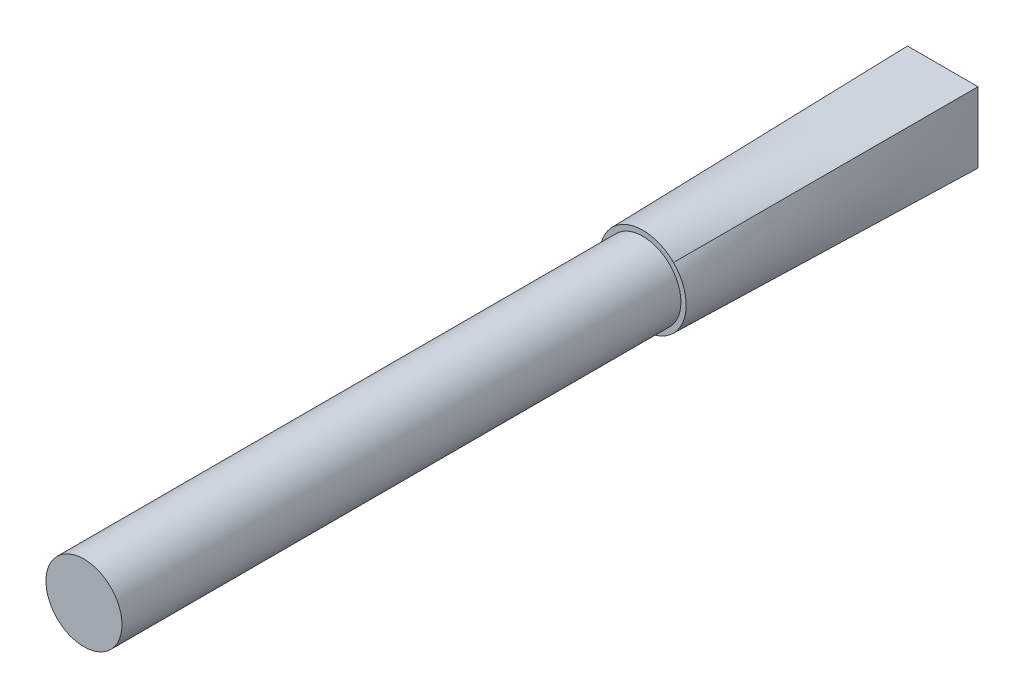
ISO-10303-21;
HEADER;
FILE_DESCRIPTION(('STEP AP214'),'2;1');
FILE_NAME('part.step','',(''),(''),'','','');
FILE_SCHEMA(('AUTOMOTIVE_DESIGN { 1 0 10303 214 1 1 1 1 }'));
ENDSEC;
DATA;
#1=APPLICATION_CONTEXT('core data for automotive mechanical design processes');
#2=APPLICATION_PROTOCOL_DEFINITION('international standard','automotive_design',2000,#1);
#3=PRODUCT_CONTEXT('',#1,'mechanical');
#4=PRODUCT('Part','Part','',(#3));
#5=PRODUCT_RELATED_PRODUCT_CATEGORY('part','',(#4));
#6=PRODUCT_DEFINITION_FORMATION('','',#4);
#7=PRODUCT_DEFINITION_CONTEXT('part definition',#1,'design');
#8=PRODUCT_DEFINITION('design','',#6,#7);
#9=PRODUCT_DEFINITION_SHAPE('','',#8);
#10=(LENGTH_UNIT() NAMED_UNIT(*) SI_UNIT(.MILLI.,.METRE.));
#11=(NAMED_UNIT(*) PLANE_ANGLE_UNIT() SI_UNIT($,.RADIAN.));
#12=(NAMED_UNIT(*) SI_UNIT($,.STERADIAN.) SOLID_ANGLE_UNIT());
#13=UNCERTAINTY_MEASURE_WITH_UNIT(LENGTH_MEASURE(1.E-05),#10,'distance_accuracy_value','');
#14=(GEOMETRIC_REPRESENTATION_CONTEXT(3) GLOBAL_UNCERTAINTY_ASSIGNED_CONTEXT((#13)) GLOBAL_UNIT_ASSIGNED_CONTEXT((#10,
#11,#12)) REPRESENTATION_CONTEXT('',''));
#15=CARTESIAN_POINT('',(0.,0.,0.));
#16=DIRECTION('',(0.,0.,1.));
#17=DIRECTION('',(1.,0.,0.));
#18=AXIS2_PLACEMENT_3D('',#15,#16,#17);
#19=CARTESIAN_POINT('',(-46.9561399874186,36.6857906592663,17.));
#20=DIRECTION('',(0.,0.,-1.));
#21=DIRECTION('',(-1.,0.,0.));
#22=AXIS2_PLACEMENT_3D('',#19,#20,#21);
#23=CYLINDRICAL_SURFACE('',#22,6.15);
#24=CARTESIAN_POINT('',(-46.9561399874186,36.6857906592663,17.));
#25=DIRECTION('',(0.,0.,1.));
#26=DIRECTION('',(1.,0.,0.));
#27=AXIS2_PLACEMENT_3D('',#24,#25,#26);
#28=CIRCLE('',#27,6.15);
#29=CARTESIAN_POINT('',(-40.8061399874186,36.6857906592663,17.));
#30=VERTEX_POINT('',#29);
#31=EDGE_CURVE('E269',#30,#30,#28,.T.);
#32=ORIENTED_EDGE('',*,*,#31,.F.);
#33=EDGE_LOOP('',(#32));
#34=FACE_BOUND('',#33,.T.);
#35=CARTESIAN_POINT('',(-46.9561399874186,36.6857906592663,-73.4));
#36=DIRECTION('',(0.,0.,1.));
#37=DIRECTION('',(1.,0.,0.));
#38=AXIS2_PLACEMENT_3D('',#35,#36,#37);
#39=CIRCLE('',#38,6.15);
#40=CARTESIAN_POINT('',(-40.8061399874186,36.6857906592663,-73.4));
#41=VERTEX_POINT('',#40);
#42=EDGE_CURVE('E408',#41,#41,#39,.T.);
#43=ORIENTED_EDGE('',*,*,#42,.T.);
#44=EDGE_LOOP('',(#43));
#45=FACE_BOUND('',#44,.T.);
#46=ADVANCED_FACE('F69',(#34,#45),#23,.T.);
#47=CARTESIAN_POINT('',(-46.9561399874186,36.6857906592663,17.));
#48=DIRECTION('',(0.,0.,1.));
#49=DIRECTION('',(1.,0.,0.));
#50=AXIS2_PLACEMENT_3D('',#47,#48,#49);
#51=PLANE('',#50);
#52=ORIENTED_EDGE('',*,*,#31,.T.);
#53=EDGE_LOOP('',(#52));
#54=FACE_BOUND('',#53,.T.);
#55=ADVANCED_FACE('F254',(#54),#51,.T.);
#56=CARTESIAN_POINT('',(-46.9561399874187,36.6857906592662,-73.4));
#57=DIRECTION('',(0.,0.,-1.));
#58=DIRECTION('',(-1.,0.,0.));
#59=AXIS2_PLACEMENT_3D('',#56,#57,#58);
#60=PLANE('',#59);
#61=ORIENTED_EDGE('',*,*,#42,.F.);
#62=EDGE_LOOP('',(#61));
#63=FACE_BOUND('',#62,.T.);
#64=CARTESIAN_POINT('',(-42.0063925191129,31.7360431909604,-73.4));
#65=CARTESIAN_POINT('',(-42.1456633403766,31.5968151956162,-73.4));
#66=CARTESIAN_POINT('',(-42.2908078767657,31.4634508637086,-73.4));
#67=CARTESIAN_POINT('',(-42.5917886116688,31.2094045075986,-73.4));
#68=CARTESIAN_POINT('',(-42.7476243084859,31.0887218889621,-73.4));
#69=CARTESIAN_POINT('',(-43.0687841504961,30.8610946060958,-73.4));
#70=CARTESIAN_POINT('',(-43.2340986487157,30.7541363208907,-73.4));
#71=CARTESIAN_POINT('',(-43.5732181859183,30.5544239115388,-73.4));
#72=CARTESIAN_POINT('',(-43.7470268764009,30.4616759682783,-73.4));
#73=CARTESIAN_POINT('',(-44.013132376626,30.3337643078239,-73.4));
#74=CARTESIAN_POINT('',(-44.1027672788285,30.2929823898799,-73.4));
#75=CARTESIAN_POINT('',(-44.283690679333,30.2152682059981,-73.4));
#76=CARTESIAN_POINT('',(-44.3749791765763,30.1783359375957,-73.4));
#77=CARTESIAN_POINT('',(-44.6509670196658,30.0733900300036,-73.4));
#78=CARTESIAN_POINT('',(-44.8379062949972,30.01117086082,-73.4));
#79=CARTESIAN_POINT('',(-45.2163391316847,29.9026393904692,-73.4));
#80=CARTESIAN_POINT('',(-45.4078329552131,29.8563280073785,-73.4));
#81=CARTESIAN_POINT('',(-45.7940584104982,29.780132469075,-73.4));
#82=CARTESIAN_POINT('',(-45.9887900237924,29.7502482202235,-73.4));
#83=CARTESIAN_POINT('',(-46.3799221774178,29.7068820965488,-73.4));
#84=CARTESIAN_POINT('',(-46.5763211352012,29.6933861112952,-73.4));
#85=CARTESIAN_POINT('',(-46.871203708463,29.6856193020037,-73.4));
#86=CARTESIAN_POINT('',(-46.9695562365239,29.6851105327817,-73.4));
#87=CARTESIAN_POINT('',(-47.1661945841645,29.6882702486812,-73.4));
#88=CARTESIAN_POINT('',(-47.2644804029289,29.6919387839746,-73.4));
#89=CARTESIAN_POINT('',(-47.5590032335952,29.7091278738986,-73.4));
#90=CARTESIAN_POINT('',(-47.754915119356,29.7288316702664,-73.4));
#91=CARTESIAN_POINT('',(-48.1443633002955,29.7846189507533,-73.4));
#92=CARTESIAN_POINT('',(-48.3378996329995,29.820702175793,-73.4));
#93=CARTESIAN_POINT('',(-48.7213220459782,29.9091724755786,-73.4));
#94=CARTESIAN_POINT('',(-48.9112065342883,29.9615664970428,-73.4));
#95=CARTESIAN_POINT('',(-49.2858702535804,30.0820070840367,-73.4));
#96=CARTESIAN_POINT('',(-49.4706491662281,30.1500546231125,-73.4));
#97=CARTESIAN_POINT('',(-50.0151995599403,30.3773157024135,-73.4));
#98=CARTESIAN_POINT('',(-50.3657623598617,30.5597808738954,-73.3999999999999));
#99=CARTESIAN_POINT('',(-50.8072974833803,30.8389839696204,-73.4));
#100=CARTESIAN_POINT('',(-50.9146103030249,30.9110863168082,-73.4));
#101=CARTESIAN_POINT('',(-51.1250667563629,31.0611439523448,-73.4));
#102=CARTESIAN_POINT('',(-51.2282112645006,31.1390980031922,-73.4));
#103=CARTESIAN_POINT('',(-51.5306352543509,31.3810916534136,-73.4));
#104=CARTESIAN_POINT('',(-51.7232809541746,31.5535007788598,-73.3999999999999));
#105=CARTESIAN_POINT('',(-51.9058874557245,31.7360431909604,-73.4));
#106=B_SPLINE_CURVE_WITH_KNOTS('',3,(#64,#65,#66,#67,#68,#69,#70,#71,#72,#73,#74,#75,#76,#77,
#78,#79,#80,#81,#82,#83,#84,#85,#86,#87,#88,#89,#90,#91,#92,#93,#94,#95,#96,#97,#98,#99,#100,
#101,#102,#103,#104,#105),.UNSPECIFIED.,.F.,.F.,(4,2,2,2,2,2,2,2,2,2,2,2,2,2,2,2,2,2,2,2,4),(0.,
0.590627625091379,1.18122755313352,1.77123671918134,2.36150178967361,2.65685399542576,
2.95220601208947,3.54252005496077,4.13286816054907,4.72321290097602,5.31304898847596,
5.60803281329684,5.90302018108694,6.49296649966613,7.08290348717232,7.67309207156466,
8.26331737174196,9.44201062753643,9.82976176125312,10.2174311242531,10.9914431983338),.UNSPECIFIED.);
#107=CARTESIAN_POINT('',(-42.0063925191129,31.7360431909604,-73.4));
#108=VERTEX_POINT('',#107);
#109=CARTESIAN_POINT('',(-51.9058874557245,31.7360431909604,-73.4));
#110=VERTEX_POINT('',#109);
#111=EDGE_CURVE('E239',#108,#110,#106,.T.);
#112=ORIENTED_EDGE('',*,*,#111,.F.);
#113=CARTESIAN_POINT('',(-42.0063925191129,41.6355381275721,-73.4));
#114=CARTESIAN_POINT('',(-41.8671645237687,41.4962673063083,-73.4));
#115=CARTESIAN_POINT('',(-41.7338001918611,41.3511227699192,-73.4));
#116=CARTESIAN_POINT('',(-41.4797538357511,41.0501420350162,-73.4));
#117=CARTESIAN_POINT('',(-41.3590712171146,40.8943063381991,-73.4));
#118=CARTESIAN_POINT('',(-41.1314439342483,40.5731464961889,-73.4));
#119=CARTESIAN_POINT('',(-41.0244856490432,40.4078319979693,-73.4));
#120=CARTESIAN_POINT('',(-40.8247732396912,40.0687124607667,-73.4));
#121=CARTESIAN_POINT('',(-40.7320252964308,39.8949037702841,-73.3999999999999));
#122=CARTESIAN_POINT('',(-40.6041136359764,39.6287982700591,-73.4));
#123=CARTESIAN_POINT('',(-40.5633317180323,39.5391633678566,-73.4));
#124=CARTESIAN_POINT('',(-40.4856175341506,39.358239967352,-73.4));
#125=CARTESIAN_POINT('',(-40.4486852657482,39.2669514701087,-73.4));
#126=CARTESIAN_POINT('',(-40.3437393581561,38.9909636270193,-73.4));
#127=CARTESIAN_POINT('',(-40.2815201889725,38.8040243516879,-73.4));
#128=CARTESIAN_POINT('',(-40.1729887186216,38.4255915150004,-73.4));
#129=CARTESIAN_POINT('',(-40.126677335531,38.2340976914721,-73.4));
#130=CARTESIAN_POINT('',(-40.0504817972274,37.8478722361869,-73.4));
#131=CARTESIAN_POINT('',(-40.020597548376,37.6531406228927,-73.4));
#132=CARTESIAN_POINT('',(-39.9772314247013,37.2620084692674,-73.4));
#133=CARTESIAN_POINT('',(-39.9637354394477,37.065609511484,-73.4));
#134=CARTESIAN_POINT('',(-39.9559686301562,36.7707269382222,-73.4));
#135=CARTESIAN_POINT('',(-39.9554598609341,36.6723744101613,-73.4));
#136=CARTESIAN_POINT('',(-39.9586195768336,36.4757360625207,-73.4));
#137=CARTESIAN_POINT('',(-39.9622881121271,36.3774502437563,-73.4));
#138=CARTESIAN_POINT('',(-39.9794772020511,36.08292741309,-73.4));
#139=CARTESIAN_POINT('',(-39.9991809984188,35.8870155273292,-73.4));
#140=CARTESIAN_POINT('',(-40.0549682789058,35.4975673463897,-73.4));
#141=CARTESIAN_POINT('',(-40.0910515039454,35.3040310136857,-73.4));
#142=CARTESIAN_POINT('',(-40.179521803731,34.920608600707,-73.4));
#143=CARTESIAN_POINT('',(-40.2319158251951,34.7307241123969,-73.4));
#144=CARTESIAN_POINT('',(-40.352356412189,34.3560603931048,-73.4));
#145=CARTESIAN_POINT('',(-40.4204039512648,34.1712814804571,-73.4));
#146=CARTESIAN_POINT('',(-40.6476650305658,33.6267310867449,-73.4));
#147=CARTESIAN_POINT('',(-40.8301302020477,33.2761682868235,-73.4));
#148=CARTESIAN_POINT('',(-41.1093332977727,32.8346331633049,-73.4));
#149=CARTESIAN_POINT('',(-41.1814356449605,32.7273203436602,-73.4));
#150=CARTESIAN_POINT('',(-41.3314932804971,32.5168638903221,-73.4));
#151=CARTESIAN_POINT('',(-41.4094473313445,32.4137193821844,-73.4));
#152=CARTESIAN_POINT('',(-41.6514409815659,32.1112953923341,-73.4));
#153=CARTESIAN_POINT('',(-41.8238501070122,31.9186496925104,-73.4));
#154=CARTESIAN_POINT('',(-42.0063925191129,31.7360431909604,-73.4));
#155=B_SPLINE_CURVE_WITH_KNOTS('',3,(#113,#114,#115,#116,#117,#118,#119,#120,#121,#122,#123,
#124,#125,#126,#127,#128,#129,#130,#131,#132,#133,#134,#135,#136,#137,#138,#139,#140,#141,#142,
#143,#144,#145,#146,#147,#148,#149,#150,#151,#152,#153,#154),.UNSPECIFIED.,.F.,.F.,(4,2,2,2,2,2,
2,2,2,2,2,2,2,2,2,2,2,2,2,2,4),(0.,0.590627625091344,1.18122755313346,1.77123671918127,
2.36150178967351,2.65685399542565,2.95220601208934,3.54252005496062,4.1328681605489,
4.72321290097582,5.31304898847573,5.60803281329661,5.90302018108667,6.49296649966585,
7.08290348717201,7.67309207156436,8.26331737174168,9.44201062753618,9.82976176125293,
10.2174311242529,10.9914431983338),.UNSPECIFIED.);
#156=CARTESIAN_POINT('',(-42.0063925191129,41.6355381275721,-73.4));
#157=VERTEX_POINT('',#156);
#158=EDGE_CURVE('E190',#157,#108,#155,.T.);
#159=ORIENTED_EDGE('',*,*,#158,.F.);
#160=CARTESIAN_POINT('',(-51.9058874557245,41.6355381275721,-73.4));
#161=CARTESIAN_POINT('',(-51.7666166344608,41.7747661229162,-73.4));
#162=CARTESIAN_POINT('',(-51.6214720980717,41.9081304548239,-73.4));
#163=CARTESIAN_POINT('',(-51.3204913631686,42.1621768109338,-73.4));
#164=CARTESIAN_POINT('',(-51.1646556663515,42.2828594295704,-73.4));
#165=CARTESIAN_POINT('',(-50.8434958243414,42.5104867124366,-73.4));
#166=CARTESIAN_POINT('',(-50.6781813261218,42.6174449976417,-73.4));
#167=CARTESIAN_POINT('',(-50.3390617889192,42.8171574069937,-73.4));
#168=CARTESIAN_POINT('',(-50.1652530984366,42.9099053502542,-73.4));
#169=CARTESIAN_POINT('',(-49.8991475982116,43.0378170107085,-73.4));
#170=CARTESIAN_POINT('',(-49.8095126960091,43.0785989286526,-73.4));
#171=CARTESIAN_POINT('',(-49.6285892955045,43.1563131125343,-73.4));
#172=CARTESIAN_POINT('',(-49.5373007982612,43.1932453809367,-73.4));
#173=CARTESIAN_POINT('',(-49.2613129551718,43.2981912885288,-73.4));
#174=CARTESIAN_POINT('',(-49.0743736798404,43.3604104577125,-73.4));
#175=CARTESIAN_POINT('',(-48.6959408431529,43.4689419280633,-73.4));
#176=CARTESIAN_POINT('',(-48.5044470196246,43.515253311154,-73.4));
#177=CARTESIAN_POINT('',(-48.1182215643394,43.5914488494575,-73.4));
#178=CARTESIAN_POINT('',(-47.9234899510453,43.6213330983089,-73.4));
#179=CARTESIAN_POINT('',(-47.5323577974199,43.6646992219836,-73.4));
#180=CARTESIAN_POINT('',(-47.3359588396365,43.6781952072373,-73.4));
#181=CARTESIAN_POINT('',(-47.0410762663748,43.6859620165288,-73.4));
#182=CARTESIAN_POINT('',(-46.9427237383138,43.6864707857508,-73.4));
#183=CARTESIAN_POINT('',(-46.7460853906732,43.6833110698513,-73.4));
#184=CARTESIAN_POINT('',(-46.6477995719089,43.6796425345579,-73.4));
#185=CARTESIAN_POINT('',(-46.3532767412426,43.6624534446339,-73.4));
#186=CARTESIAN_POINT('',(-46.1573648554817,43.6427496482661,-73.4));
#187=CARTESIAN_POINT('',(-45.7679166745422,43.5869623677792,-73.4));
#188=CARTESIAN_POINT('',(-45.5743803418382,43.5508791427395,-73.4));
#189=CARTESIAN_POINT('',(-45.1909579288595,43.4624088429539,-73.4));
#190=CARTESIAN_POINT('',(-45.0010734405494,43.4100148214898,-73.4));
#191=CARTESIAN_POINT('',(-44.6264097212573,43.2895742344959,-73.4));
#192=CARTESIAN_POINT('',(-44.4416308086096,43.2215266954201,-73.4));
#193=CARTESIAN_POINT('',(-43.8970804148975,42.9942656161192,-73.4));
#194=CARTESIAN_POINT('',(-43.5465176149761,42.8118004446373,-73.4));
#195=CARTESIAN_POINT('',(-43.1049824914575,42.5325973489124,-73.4));
#196=CARTESIAN_POINT('',(-42.9976696718128,42.4604950017245,-73.4));
#197=CARTESIAN_POINT('',(-42.7872132184747,42.3104373661879,-73.4));
#198=CARTESIAN_POINT('',(-42.684068710337,42.2324833153405,-73.4));
#199=CARTESIAN_POINT('',(-42.3816447204866,41.990489665119,-73.4));
#200=CARTESIAN_POINT('',(-42.1889990206629,41.8180805396727,-73.4));
#201=CARTESIAN_POINT('',(-42.0063925191129,41.6355381275721,-73.4));
#202=B_SPLINE_CURVE_WITH_KNOTS('',3,(#160,#161,#162,#163,#164,#165,#166,#167,#168,#169,#170,
#171,#172,#173,#174,#175,#176,#177,#178,#179,#180,#181,#182,#183,#184,#185,#186,#187,#188,#189,
#190,#191,#192,#193,#194,#195,#196,#197,#198,#199,#200,#201),.UNSPECIFIED.,.F.,.F.,(4,2,2,2,2,2,
2,2,2,2,2,2,2,2,2,2,2,2,2,2,4),(0.,0.590627625091339,1.18122755313344,1.77123671918122,
2.36150178967346,2.65685399542559,2.95220601208926,3.54252005496053,4.13286816054879,
4.7232129009757,5.31304898847563,5.60803281329651,5.90302018108659,6.49296649966579,
7.08290348717196,7.67309207156428,8.26331737174156,9.44201062753598,9.82976176125276,
10.2174311242528,10.9914431983338),.UNSPECIFIED.);
#203=CARTESIAN_POINT('',(-51.9058874557245,41.6355381275721,-73.4));
#204=VERTEX_POINT('',#203);
#205=EDGE_CURVE('E192',#204,#157,#202,.T.);
#206=ORIENTED_EDGE('',*,*,#205,.F.);
#207=CARTESIAN_POINT('',(-51.9058874557245,31.7360431909604,-73.4));
#208=CARTESIAN_POINT('',(-52.0451154510687,31.8753140122242,-73.4));
#209=CARTESIAN_POINT('',(-52.1784797829763,32.0204585486132,-73.4));
#210=CARTESIAN_POINT('',(-52.4325261390863,32.3214392835163,-73.4));
#211=CARTESIAN_POINT('',(-52.5532087577228,32.4772749803334,-73.4));
#212=CARTESIAN_POINT('',(-52.7808360405891,32.7984348223435,-73.4));
#213=CARTESIAN_POINT('',(-52.8877943257942,32.9637493205632,-73.4));
#214=CARTESIAN_POINT('',(-53.0875067351461,33.3028688577657,-73.4));
#215=CARTESIAN_POINT('',(-53.1802546784066,33.4766775482483,-73.4));
#216=CARTESIAN_POINT('',(-53.308166338861,33.7427830484733,-73.4));
#217=CARTESIAN_POINT('',(-53.348948256805,33.8324179506759,-73.4));
#218=CARTESIAN_POINT('',(-53.4266624406868,34.0133413511804,-73.4));
#219=CARTESIAN_POINT('',(-53.4635947090891,34.1046298484237,-73.4));
#220=CARTESIAN_POINT('',(-53.5685406166813,34.3806176915131,-73.4));
#221=CARTESIAN_POINT('',(-53.6307597858649,34.5675569668445,-73.4));
#222=CARTESIAN_POINT('',(-53.7392912562157,34.945989803532,-73.4));
#223=CARTESIAN_POINT('',(-53.7856026393064,35.1374836270603,-73.4));
#224=CARTESIAN_POINT('',(-53.8617981776099,35.5237090823454,-73.4));
#225=CARTESIAN_POINT('',(-53.8916824264614,35.7184406956396,-73.4));
#226=CARTESIAN_POINT('',(-53.9350485501361,36.1095728492649,-73.4));
#227=CARTESIAN_POINT('',(-53.9485445353897,36.3059718070484,-73.4));
#228=CARTESIAN_POINT('',(-53.9563113446812,36.6008543803102,-73.4));
#229=CARTESIAN_POINT('',(-53.9568201139033,36.6992069083711,-73.4));
#230=CARTESIAN_POINT('',(-53.9536603980038,36.8958452560118,-73.4));
#231=CARTESIAN_POINT('',(-53.9499918627103,36.9941310747761,-73.4));
#232=CARTESIAN_POINT('',(-53.9328027727863,37.2886539054424,-73.4));
#233=CARTESIAN_POINT('',(-53.9130989764186,37.4845657912033,-73.4));
#234=CARTESIAN_POINT('',(-53.8573116959316,37.8740139721428,-73.4));
#235=CARTESIAN_POINT('',(-53.821228470892,38.0675503048468,-73.4));
#236=CARTESIAN_POINT('',(-53.7327581711064,38.4509727178256,-73.4));
#237=CARTESIAN_POINT('',(-53.6803641496422,38.6408572061357,-73.4));
#238=CARTESIAN_POINT('',(-53.5599235626483,39.0155209254278,-73.4));
#239=CARTESIAN_POINT('',(-53.4918760235725,39.2002998380755,-73.4));
#240=CARTESIAN_POINT('',(-53.2646149442715,39.7448502317877,-73.4));
#241=CARTESIAN_POINT('',(-53.0821497727897,40.0954130317091,-73.4000000000001));
#242=CARTESIAN_POINT('',(-52.8029466770647,40.5369481552277,-73.4));
#243=CARTESIAN_POINT('',(-52.7308443298768,40.6442609748724,-73.4));
#244=CARTESIAN_POINT('',(-52.5807866943402,40.8547174282104,-73.4));
#245=CARTESIAN_POINT('',(-52.5028326434929,40.9578619363481,-73.4));
#246=CARTESIAN_POINT('',(-52.2608389932714,41.2602859261984,-73.4));
#247=CARTESIAN_POINT('',(-52.0884298678252,41.4529316260221,-73.4));
#248=CARTESIAN_POINT('',(-51.9058874557245,41.6355381275721,-73.4));
#249=B_SPLINE_CURVE_WITH_KNOTS('',3,(#207,#208,#209,#210,#211,#212,#213,#214,#215,#216,#217,
#218,#219,#220,#221,#222,#223,#224,#225,#226,#227,#228,#229,#230,#231,#232,#233,#234,#235,#236,
#237,#238,#239,#240,#241,#242,#243,#244,#245,#246,#247,#248),.UNSPECIFIED.,.F.,.F.,(4,2,2,2,2,2,
2,2,2,2,2,2,2,2,2,2,2,2,2,2,4),(0.,0.590627625091339,1.18122755313343,1.77123671918121,
2.36150178967344,2.65685399542557,2.95220601208924,3.5425200549605,4.13286816054874,
4.72321290097564,5.31304898847562,5.60803281329653,5.90302018108663,6.49296649966587,
7.08290348717211,7.67309207156445,8.26331737174176,9.44201062753624,9.82976176125298,
10.217431124253,10.9914431983338),.UNSPECIFIED.);
#250=EDGE_CURVE('E260',#110,#204,#249,.T.);
#251=ORIENTED_EDGE('',*,*,#250,.F.);
#252=EDGE_LOOP('',(#112,#159,#206,#251));
#253=FACE_BOUND('',#252,.T.);
#254=ADVANCED_FACE('F250',(#63,#253),#60,.F.);
#255=CARTESIAN_POINT('',(0.,0.,-121.9));
#256=DIRECTION('',(0.,0.,-1.));
#257=DIRECTION('',(-1.,0.,0.));
#258=AXIS2_PLACEMENT_3D('',#255,#256,#257);
#259=PLANE('',#258);
#260=DIRECTION('',(0.,1.,0.));
#261=VECTOR('',#260,1.);
#262=CARTESIAN_POINT('',(-51.8061399874187,31.8357906592662,-121.9));
#263=LINE('',#262,#261);
#264=CARTESIAN_POINT('',(-51.8061399874187,32.8357906592662,-121.9));
#265=VERTEX_POINT('',#264);
#266=CARTESIAN_POINT('',(-51.8061399874187,40.5357906592662,-121.9));
#267=VERTEX_POINT('',#266);
#268=EDGE_CURVE('E307',#265,#267,#263,.T.);
#269=ORIENTED_EDGE('',*,*,#268,.F.);
#270=CARTESIAN_POINT('',(-50.8061399874187,32.8357906592662,-121.9));
#271=DIRECTION('',(0.,0.,-1.));
#272=DIRECTION('',(-1.,0.,0.));
#273=AXIS2_PLACEMENT_3D('',#270,#271,#272);
#274=CIRCLE('',#273,1.);
#275=CARTESIAN_POINT('',(-50.8061399874187,31.8357906592662,-121.9));
#276=VERTEX_POINT('',#275);
#277=EDGE_CURVE('E296',#265,#276,#274,.F.);
#278=ORIENTED_EDGE('',*,*,#277,.T.);
#279=DIRECTION('',(-1.,0.,0.));
#280=VECTOR('',#279,1.);
#281=CARTESIAN_POINT('',(-42.1061399874187,31.8357906592662,-121.9));
#282=LINE('',#281,#280);
#283=CARTESIAN_POINT('',(-43.1061399874187,31.8357906592662,-121.9));
#284=VERTEX_POINT('',#283);
#285=EDGE_CURVE('E333',#284,#276,#282,.T.);
#286=ORIENTED_EDGE('',*,*,#285,.F.);
#287=CARTESIAN_POINT('',(-43.1061399874187,32.8357906592662,-121.9));
#288=DIRECTION('',(0.,0.,-1.));
#289=DIRECTION('',(-1.,0.,0.));
#290=AXIS2_PLACEMENT_3D('',#287,#288,#289);
#291=CIRCLE('',#290,1.);
#292=CARTESIAN_POINT('',(-42.1061399874187,32.8357906592662,-121.9));
#293=VERTEX_POINT('',#292);
#294=EDGE_CURVE('E12',#284,#293,#291,.F.);
#295=ORIENTED_EDGE('',*,*,#294,.T.);
#296=DIRECTION('',(0.,-1.,0.));
#297=VECTOR('',#296,1.);
#298=CARTESIAN_POINT('',(-42.1061399874187,31.8357906592662,-121.9));
#299=LINE('',#298,#297);
#300=CARTESIAN_POINT('',(-42.1061399874187,40.5357906592662,-121.9));
#301=VERTEX_POINT('',#300);
#302=EDGE_CURVE('E301',#301,#293,#299,.T.);
#303=ORIENTED_EDGE('',*,*,#302,.F.);
#304=CARTESIAN_POINT('',(-43.1061399874187,40.5357906592662,-121.9));
#305=DIRECTION('',(0.,0.,-1.));
#306=DIRECTION('',(-1.,0.,0.));
#307=AXIS2_PLACEMENT_3D('',#304,#305,#306);
#308=CIRCLE('',#307,1.);
#309=CARTESIAN_POINT('',(-43.1061399874187,41.5357906592662,-121.9));
#310=VERTEX_POINT('',#309);
#311=EDGE_CURVE('E77',#301,#310,#308,.F.);
#312=ORIENTED_EDGE('',*,*,#311,.T.);
#313=DIRECTION('',(1.,0.,0.));
#314=VECTOR('',#313,1.);
#315=CARTESIAN_POINT('',(-42.1061399874187,41.5357906592662,-121.9));
#316=LINE('',#315,#314);
#317=CARTESIAN_POINT('',(-50.8061399874187,41.5357906592662,-121.9));
#318=VERTEX_POINT('',#317);
#319=EDGE_CURVE('E300',#318,#310,#316,.T.);
#320=ORIENTED_EDGE('',*,*,#319,.F.);
#321=CARTESIAN_POINT('',(-50.8061399874187,40.5357906592662,-121.9));
#322=DIRECTION('',(0.,0.,-1.));
#323=DIRECTION('',(-1.,0.,0.));
#324=AXIS2_PLACEMENT_3D('',#321,#322,#323);
#325=CIRCLE('',#324,1.);
#326=EDGE_CURVE('E294',#318,#267,#325,.F.);
#327=ORIENTED_EDGE('',*,*,#326,.T.);
#328=EDGE_LOOP('',(#269,#278,#286,#295,#303,#312,#320,#327));
#329=FACE_BOUND('',#328,.T.);
#330=DIRECTION('',(0.,1.,0.));
#331=VECTOR('',#330,1.);
#332=CARTESIAN_POINT('',(-52.6561399874187,42.3857906592662,-121.9));
#333=LINE('',#332,#331);
#334=CARTESIAN_POINT('',(-52.6561399874187,30.9857906592662,-121.9));
#335=VERTEX_POINT('',#334);
#336=CARTESIAN_POINT('',(-52.6561399874187,42.3857906592662,-121.9));
#337=VERTEX_POINT('',#336);
#338=EDGE_CURVE('E183',#335,#337,#333,.T.);
#339=ORIENTED_EDGE('',*,*,#338,.T.);
#340=DIRECTION('',(1.,0.,0.));
#341=VECTOR('',#340,1.);
#342=CARTESIAN_POINT('',(-41.2561399874187,42.3857906592662,-121.9));
#343=LINE('',#342,#341);
#344=CARTESIAN_POINT('',(-41.2561399874187,42.3857906592662,-121.9));
#345=VERTEX_POINT('',#344);
#346=EDGE_CURVE('E165',#337,#345,#343,.T.);
#347=ORIENTED_EDGE('',*,*,#346,.T.);
#348=DIRECTION('',(0.,-1.,0.));
#349=VECTOR('',#348,1.);
#350=CARTESIAN_POINT('',(-41.2561399874187,42.3857906592662,-121.9));
#351=LINE('',#350,#349);
#352=CARTESIAN_POINT('',(-41.2561399874187,30.9857906592662,-121.9));
#353=VERTEX_POINT('',#352);
#354=EDGE_CURVE('E156',#345,#353,#351,.T.);
#355=ORIENTED_EDGE('',*,*,#354,.T.);
#356=DIRECTION('',(-1.,0.,0.));
#357=VECTOR('',#356,1.);
#358=CARTESIAN_POINT('',(-41.2561399874187,30.9857906592662,-121.9));
#359=LINE('',#358,#357);
#360=EDGE_CURVE('E161',#353,#335,#359,.T.);
#361=ORIENTED_EDGE('',*,*,#360,.T.);
#362=EDGE_LOOP('',(#339,#347,#355,#361));
#363=FACE_BOUND('',#362,.T.);
#364=ADVANCED_FACE('F160',(#329,#363),#259,.T.);
#365=CARTESIAN_POINT('',(-41.2561399874187,42.3857906592662,-121.9));
#366=CARTESIAN_POINT('',(-42.0063925191129,41.6355381275721,-73.4));
#367=CARTESIAN_POINT('',(-41.7311399874187,42.3857906592662,-121.9));
#368=CARTESIAN_POINT('',(-42.2980591857795,41.9272047942387,-73.4));
#369=CARTESIAN_POINT('',(-42.2061399874187,42.3857906592662,-121.9));
#370=CARTESIAN_POINT('',(-42.6265616505408,42.2038502667191,-73.4));
#371=CARTESIAN_POINT('',(-43.1561399874187,42.3857906592662,-121.9));
#372=CARTESIAN_POINT('',(-43.3528341245181,42.7032998836008,-73.4));
#373=CARTESIAN_POINT('',(-43.6311399874187,42.3857906592662,-121.9));
#374=CARTESIAN_POINT('',(-43.7506412226672,42.9259423190002,-73.4));
#375=CARTESIAN_POINT('',(-44.5811399874187,42.3857906592662,-121.9));
#376=CARTESIAN_POINT('',(-44.6011558871832,43.2940252915218,-73.4));
#377=CARTESIAN_POINT('',(-45.0561399874187,42.3857906592662,-121.9));
#378=CARTESIAN_POINT('',(-45.0537968660308,43.4392854136708,-73.4));
#379=CARTESIAN_POINT('',(-46.0061399874187,42.3857906592662,-121.9));
#380=CARTESIAN_POINT('',(-45.9897504664316,43.6352289130381,-73.4));
#381=CARTESIAN_POINT('',(-46.4811399874187,42.3857906592662,-121.9));
#382=CARTESIAN_POINT('',(-46.4728908313168,43.6857906592662,-73.4));
#383=CARTESIAN_POINT('',(-47.4311399874187,42.3857906592662,-121.9));
#384=CARTESIAN_POINT('',(-47.4393891435206,43.6857906592662,-73.4));
#385=CARTESIAN_POINT('',(-47.9061399874187,42.3857906592662,-121.9));
#386=CARTESIAN_POINT('',(-47.9225295084058,43.6352289130381,-73.4));
#387=CARTESIAN_POINT('',(-48.8561399874187,42.3857906592662,-121.9));
#388=CARTESIAN_POINT('',(-48.8584831088066,43.4392854136708,-73.4));
#389=CARTESIAN_POINT('',(-49.3311399874187,42.3857906592662,-121.9));
#390=CARTESIAN_POINT('',(-49.3111240876542,43.2940252915218,-73.4));
#391=CARTESIAN_POINT('',(-50.2811399874187,42.3857906592662,-121.9));
#392=CARTESIAN_POINT('',(-50.1616387521702,42.9259423190002,-73.4));
#393=CARTESIAN_POINT('',(-50.7561399874187,42.3857906592662,-121.9));
#394=CARTESIAN_POINT('',(-50.5594458503193,42.7032998836008,-73.4));
#395=CARTESIAN_POINT('',(-51.7061399874187,42.3857906592662,-121.9));
#396=CARTESIAN_POINT('',(-51.2857183242966,42.2038502667191,-73.4));
#397=CARTESIAN_POINT('',(-52.1811399874187,42.3857906592662,-121.9));
#398=CARTESIAN_POINT('',(-51.6142207890579,41.9272047942387,-73.4));
#399=CARTESIAN_POINT('',(-52.6561399874187,42.3857906592662,-121.9));
#400=CARTESIAN_POINT('',(-51.9058874557245,41.6355381275721,-73.4));
#401=B_SPLINE_SURFACE_WITH_KNOTS('',3,1,((#365,#366),(#367,#368),(#369,#370),(#371,#372),(#373,
#374),(#375,#376),(#377,#378),(#379,#380),(#381,#382),(#383,#384),(#385,#386),(#387,#388),(#389,
#390),(#391,#392),(#393,#394),(#395,#396),(#397,#398),(#399,#400)),.UNSPECIFIED.,.F.,.F.,.F.,(4,
2,2,2,2,2,2,2,4),(2,2),(0.,0.125,0.25,0.375,0.5,0.625,0.75,0.875,1.),(0.,1.),.UNSPECIFIED.);
#402=DIRECTION('',(0.0154654240272916,-0.0154654240272917,0.999760792049434));
#403=VECTOR('',#402,1.);
#404=CARTESIAN_POINT('',(-52.2810137215716,42.0106643934192,-97.65));
#405=LINE('',#404,#403);
#406=EDGE_CURVE('E194',#337,#204,#405,.T.);
#407=DIRECTION('',(0.0154654240272923,0.0154654240272917,-0.999760792049434));
#408=VECTOR('',#407,1.);
#409=CARTESIAN_POINT('',(-41.6312662532658,42.0106643934192,-97.65));
#410=LINE('',#409,#408);
#411=EDGE_CURVE('E342',#157,#345,#410,.T.);
#412=ORIENTED_EDGE('',*,*,#346,.F.);
#413=ORIENTED_EDGE('',*,*,#406,.T.);
#414=ORIENTED_EDGE('',*,*,#205,.T.);
#415=ORIENTED_EDGE('',*,*,#411,.T.);
#416=EDGE_LOOP('',(#412,#413,#414,#415));
#417=FACE_BOUND('',#416,.T.);
#418=ADVANCED_FACE('F344',(#417),#401,.T.);
#419=CARTESIAN_POINT('',(-52.6561399874187,42.3857906592662,-121.9));
#420=CARTESIAN_POINT('',(-51.9058874557245,41.6355381275721,-73.4));
#421=CARTESIAN_POINT('',(-52.6561399874187,41.9107906592662,-121.9));
#422=CARTESIAN_POINT('',(-52.1975541223912,41.3438714609054,-73.4));
#423=CARTESIAN_POINT('',(-52.6561399874187,41.4357906592662,-121.9));
#424=CARTESIAN_POINT('',(-52.4741995948715,41.0153689961442,-73.4));
#425=CARTESIAN_POINT('',(-52.6561399874187,40.4857906592662,-121.9));
#426=CARTESIAN_POINT('',(-52.9736492117532,40.2890965221668,-73.4));
#427=CARTESIAN_POINT('',(-52.6561399874187,40.0107906592662,-121.9));
#428=CARTESIAN_POINT('',(-53.1962916471527,39.8912894240177,-73.4));
#429=CARTESIAN_POINT('',(-52.6561399874187,39.0607906592662,-121.9));
#430=CARTESIAN_POINT('',(-53.5643746196743,39.0407747595017,-73.4));
#431=CARTESIAN_POINT('',(-52.6561399874187,38.5857906592662,-121.9));
#432=CARTESIAN_POINT('',(-53.7096347418233,38.5881337806541,-73.4));
#433=CARTESIAN_POINT('',(-52.6561399874187,37.6357906592662,-121.9));
#434=CARTESIAN_POINT('',(-53.9055782411906,37.6521801802533,-73.4));
#435=CARTESIAN_POINT('',(-52.6561399874187,37.1607906592662,-121.9));
#436=CARTESIAN_POINT('',(-53.9561399874187,37.1690398153682,-73.4));
#437=CARTESIAN_POINT('',(-52.6561399874187,36.2107906592662,-121.9));
#438=CARTESIAN_POINT('',(-53.9561399874187,36.2025415031643,-73.4));
#439=CARTESIAN_POINT('',(-52.6561399874187,35.7357906592662,-121.9));
#440=CARTESIAN_POINT('',(-53.9055782411906,35.7194011382791,-73.4));
#441=CARTESIAN_POINT('',(-52.6561399874187,34.7857906592662,-121.9));
#442=CARTESIAN_POINT('',(-53.7096347418233,34.7834475378783,-73.4));
#443=CARTESIAN_POINT('',(-52.6561399874187,34.3107906592662,-121.9));
#444=CARTESIAN_POINT('',(-53.5643746196743,34.3308065590307,-73.4));
#445=CARTESIAN_POINT('',(-52.6561399874187,33.3607906592662,-121.9));
#446=CARTESIAN_POINT('',(-53.1962916471527,33.4802918945148,-73.4));
#447=CARTESIAN_POINT('',(-52.6561399874187,32.8857906592662,-121.9));
#448=CARTESIAN_POINT('',(-52.9736492117533,33.0824847963656,-73.4));
#449=CARTESIAN_POINT('',(-52.6561399874187,31.9357906592662,-121.9));
#450=CARTESIAN_POINT('',(-52.4741995948715,32.3562123223883,-73.4));
#451=CARTESIAN_POINT('',(-52.6561399874187,31.4607906592662,-121.9));
#452=CARTESIAN_POINT('',(-52.1975541223912,32.0277098576271,-73.4));
#453=CARTESIAN_POINT('',(-52.6561399874187,30.9857906592662,-121.9));
#454=CARTESIAN_POINT('',(-51.9058874557245,31.7360431909604,-73.4));
#455=B_SPLINE_SURFACE_WITH_KNOTS('',3,1,((#419,#420),(#421,#422),(#423,#424),(#425,#426),(#427,
#428),(#429,#430),(#431,#432),(#433,#434),(#435,#436),(#437,#438),(#439,#440),(#441,#442),(#443,
#444),(#445,#446),(#447,#448),(#449,#450),(#451,#452),(#453,#454)),.UNSPECIFIED.,.F.,.F.,.F.,(4,
2,2,2,2,2,2,2,4),(2,2),(0.,0.125,0.25,0.375,0.5,0.625,0.75,0.875,1.),(0.,1.),.UNSPECIFIED.);
#456=DIRECTION('',(0.0154654240272916,0.0154654240272918,0.999760792049434));
#457=VECTOR('',#456,1.);
#458=CARTESIAN_POINT('',(-52.2810137215716,31.3609169251133,-97.65));
#459=LINE('',#458,#457);
#460=EDGE_CURVE('E182',#335,#110,#459,.T.);
#461=ORIENTED_EDGE('',*,*,#338,.F.);
#462=ORIENTED_EDGE('',*,*,#460,.T.);
#463=ORIENTED_EDGE('',*,*,#250,.T.);
#464=ORIENTED_EDGE('',*,*,#406,.F.);
#465=EDGE_LOOP('',(#461,#462,#463,#464));
#466=FACE_BOUND('',#465,.T.);
#467=ADVANCED_FACE('F218',(#466),#455,.T.);
#468=CARTESIAN_POINT('',(-41.2561399874187,30.9857906592662,-121.9));
#469=CARTESIAN_POINT('',(-42.0063925191129,31.7360431909604,-73.4));
#470=CARTESIAN_POINT('',(-41.2561399874187,31.4607906592662,-121.9));
#471=CARTESIAN_POINT('',(-41.7147258524462,32.0277098576271,-73.4));
#472=CARTESIAN_POINT('',(-41.2561399874187,31.9357906592662,-121.9));
#473=CARTESIAN_POINT('',(-41.4380803799659,32.3562123223883,-73.4));
#474=CARTESIAN_POINT('',(-41.2561399874187,32.8857906592662,-121.9));
#475=CARTESIAN_POINT('',(-40.9386307630841,33.0824847963657,-73.4));
#476=CARTESIAN_POINT('',(-41.2561399874187,33.3607906592663,-121.9));
#477=CARTESIAN_POINT('',(-40.7159883276847,33.4802918945148,-73.4));
#478=CARTESIAN_POINT('',(-41.2561399874187,34.3107906592663,-121.9));
#479=CARTESIAN_POINT('',(-40.3479053551631,34.3308065590307,-73.4));
#480=CARTESIAN_POINT('',(-41.2561399874187,34.7857906592663,-121.9));
#481=CARTESIAN_POINT('',(-40.2026452330141,34.7834475378783,-73.4));
#482=CARTESIAN_POINT('',(-41.2561399874187,35.7357906592663,-121.9));
#483=CARTESIAN_POINT('',(-40.0067017336468,35.7194011382791,-73.4));
#484=CARTESIAN_POINT('',(-41.2561399874187,36.2107906592663,-121.9));
#485=CARTESIAN_POINT('',(-39.9561399874187,36.2025415031643,-73.4));
#486=CARTESIAN_POINT('',(-41.2561399874187,37.1607906592663,-121.9));
#487=CARTESIAN_POINT('',(-39.9561399874187,37.1690398153682,-73.4));
#488=CARTESIAN_POINT('',(-41.2561399874187,37.6357906592663,-121.9));
#489=CARTESIAN_POINT('',(-40.0067017336468,37.6521801802533,-73.4));
#490=CARTESIAN_POINT('',(-41.2561399874187,38.5857906592663,-121.9));
#491=CARTESIAN_POINT('',(-40.2026452330141,38.5881337806541,-73.4));
#492=CARTESIAN_POINT('',(-41.2561399874187,39.0607906592663,-121.9));
#493=CARTESIAN_POINT('',(-40.3479053551631,39.0407747595018,-73.4));
#494=CARTESIAN_POINT('',(-41.2561399874187,40.0107906592663,-121.9));
#495=CARTESIAN_POINT('',(-40.7159883276847,39.8912894240177,-73.4));
#496=CARTESIAN_POINT('',(-41.2561399874187,40.4857906592663,-121.9));
#497=CARTESIAN_POINT('',(-40.9386307630842,40.2890965221668,-73.4));
#498=CARTESIAN_POINT('',(-41.2561399874187,41.4357906592663,-121.9));
#499=CARTESIAN_POINT('',(-41.4380803799659,41.0153689961442,-73.4));
#500=CARTESIAN_POINT('',(-41.2561399874187,41.9107906592662,-121.9));
#501=CARTESIAN_POINT('',(-41.7147258524462,41.3438714609054,-73.4));
#502=CARTESIAN_POINT('',(-41.2561399874187,42.3857906592662,-121.9));
#503=CARTESIAN_POINT('',(-42.0063925191129,41.6355381275721,-73.4));
#504=B_SPLINE_SURFACE_WITH_KNOTS('',3,1,((#468,#469),(#470,#471),(#472,#473),(#474,#475),(#476,
#477),(#478,#479),(#480,#481),(#482,#483),(#484,#485),(#486,#487),(#488,#489),(#490,#491),(#492,
#493),(#494,#495),(#496,#497),(#498,#499),(#500,#501),(#502,#503)),.UNSPECIFIED.,.F.,.F.,.F.,(4,
2,2,2,2,2,2,2,4),(2,2),(0.,0.125,0.25,0.375,0.5,0.625,0.75,0.875,1.),(0.,1.),.UNSPECIFIED.);
#505=DIRECTION('',(-0.0154654240272921,0.015465424027292,0.999760792049434));
#506=VECTOR('',#505,1.);
#507=CARTESIAN_POINT('',(-41.6312662532658,31.3609169251133,-97.65));
#508=LINE('',#507,#506);
#509=EDGE_CURVE('E181',#353,#108,#508,.T.);
#510=ORIENTED_EDGE('',*,*,#354,.F.);
#511=ORIENTED_EDGE('',*,*,#411,.F.);
#512=ORIENTED_EDGE('',*,*,#158,.T.);
#513=ORIENTED_EDGE('',*,*,#509,.F.);
#514=EDGE_LOOP('',(#510,#511,#512,#513));
#515=FACE_BOUND('',#514,.T.);
#516=ADVANCED_FACE('F188',(#515),#504,.T.);
#517=CARTESIAN_POINT('',(-52.6561399874187,30.9857906592662,-121.9));
#518=CARTESIAN_POINT('',(-51.9058874557245,31.7360431909604,-73.4));
#519=CARTESIAN_POINT('',(-52.1811399874186,30.9857906592662,-121.9));
#520=CARTESIAN_POINT('',(-51.6142207890579,31.4443765242938,-73.4));
#521=CARTESIAN_POINT('',(-51.7061399874185,30.9857906592662,-121.9));
#522=CARTESIAN_POINT('',(-51.2857183242966,31.1677310518134,-73.4));
#523=CARTESIAN_POINT('',(-50.7561399874184,30.9857906592662,-121.9));
#524=CARTESIAN_POINT('',(-50.5594458503193,30.6682814349317,-73.4));
#525=CARTESIAN_POINT('',(-50.2811399874184,30.9857906592662,-121.9));
#526=CARTESIAN_POINT('',(-50.1616387521702,30.4456389995322,-73.4));
#527=CARTESIAN_POINT('',(-49.3311399874183,30.9857906592662,-121.9));
#528=CARTESIAN_POINT('',(-49.3111240876542,30.0775560270106,-73.4));
#529=CARTESIAN_POINT('',(-48.8561399874183,30.9857906592662,-121.9));
#530=CARTESIAN_POINT('',(-48.8584831088066,29.9322959048617,-73.4));
#531=CARTESIAN_POINT('',(-47.9061399874183,30.9857906592662,-121.9));
#532=CARTESIAN_POINT('',(-47.9225295084058,29.7363524054943,-73.4));
#533=CARTESIAN_POINT('',(-47.4311399874183,30.9857906592662,-121.9));
#534=CARTESIAN_POINT('',(-47.4393891435206,29.6857906592662,-73.4));
#535=CARTESIAN_POINT('',(-46.4811399874183,30.9857906592662,-121.9));
#536=CARTESIAN_POINT('',(-46.4728908313168,29.6857906592662,-73.4));
#537=CARTESIAN_POINT('',(-46.0061399874183,30.9857906592662,-121.9));
#538=CARTESIAN_POINT('',(-45.9897504664316,29.7363524054943,-73.4));
#539=CARTESIAN_POINT('',(-45.0561399874183,30.9857906592662,-121.9));
#540=CARTESIAN_POINT('',(-45.0537968660308,29.9322959048617,-73.4));
#541=CARTESIAN_POINT('',(-44.5811399874183,30.9857906592662,-121.9));
#542=CARTESIAN_POINT('',(-44.6011558871832,30.0775560270107,-73.4));
#543=CARTESIAN_POINT('',(-43.6311399874184,30.9857906592662,-121.9));
#544=CARTESIAN_POINT('',(-43.7506412226672,30.4456389995322,-73.4));
#545=CARTESIAN_POINT('',(-43.1561399874184,30.9857906592662,-121.9));
#546=CARTESIAN_POINT('',(-43.3528341245181,30.6682814349317,-73.4));
#547=CARTESIAN_POINT('',(-42.2061399874185,30.9857906592662,-121.9));
#548=CARTESIAN_POINT('',(-42.6265616505408,31.1677310518134,-73.4));
#549=CARTESIAN_POINT('',(-41.7311399874186,30.9857906592662,-121.9));
#550=CARTESIAN_POINT('',(-42.2980591857795,31.4443765242938,-73.4));
#551=CARTESIAN_POINT('',(-41.2561399874187,30.9857906592662,-121.9));
#552=CARTESIAN_POINT('',(-42.0063925191129,31.7360431909604,-73.4));
#553=B_SPLINE_SURFACE_WITH_KNOTS('',3,1,((#517,#518),(#519,#520),(#521,#522),(#523,#524),(#525,
#526),(#527,#528),(#529,#530),(#531,#532),(#533,#534),(#535,#536),(#537,#538),(#539,#540),(#541,
#542),(#543,#544),(#545,#546),(#547,#548),(#549,#550),(#551,#552)),.UNSPECIFIED.,.F.,.F.,.F.,(4,
2,2,2,2,2,2,2,4),(2,2),(0.,0.125,0.25,0.375,0.5,0.625,0.75,0.875,1.),(0.,1.),.UNSPECIFIED.);
#554=ORIENTED_EDGE('',*,*,#360,.F.);
#555=ORIENTED_EDGE('',*,*,#509,.T.);
#556=ORIENTED_EDGE('',*,*,#111,.T.);
#557=ORIENTED_EDGE('',*,*,#460,.F.);
#558=EDGE_LOOP('',(#554,#555,#556,#557));
#559=FACE_BOUND('',#558,.T.);
#560=ADVANCED_FACE('F179',(#559),#553,.T.);
#561=CARTESIAN_POINT('',(-51.8061399874187,31.8357906592662,-120.4));
#562=DIRECTION('',(-1.,0.,0.));
#563=DIRECTION('',(0.,0.,1.));
#564=AXIS2_PLACEMENT_3D('',#561,#562,#563);
#565=PLANE('',#564);
#566=ORIENTED_EDGE('',*,*,#268,.T.);
#567=DIRECTION('',(0.,0.,-1.));
#568=VECTOR('',#567,1.);
#569=CARTESIAN_POINT('',(-51.8061399874187,40.5357906592662,-120.4));
#570=LINE('',#569,#568);
#571=CARTESIAN_POINT('',(-51.8061399874187,40.5357906592662,-120.4));
#572=VERTEX_POINT('',#571);
#573=EDGE_CURVE('E275',#267,#572,#570,.F.);
#574=ORIENTED_EDGE('',*,*,#573,.T.);
#575=DIRECTION('',(0.,1.,0.));
#576=VECTOR('',#575,1.);
#577=CARTESIAN_POINT('',(-51.8061399874187,31.8357906592662,-120.4));
#578=LINE('',#577,#576);
#579=CARTESIAN_POINT('',(-51.8061399874187,32.8357906592662,-120.4));
#580=VERTEX_POINT('',#579);
#581=EDGE_CURVE('E326',#580,#572,#578,.T.);
#582=ORIENTED_EDGE('',*,*,#581,.F.);
#583=DIRECTION('',(0.,0.,-1.));
#584=VECTOR('',#583,1.);
#585=CARTESIAN_POINT('',(-51.8061399874187,32.8357906592662,-121.9));
#586=LINE('',#585,#584);
#587=EDGE_CURVE('E272',#580,#265,#586,.T.);
#588=ORIENTED_EDGE('',*,*,#587,.T.);
#589=EDGE_LOOP('',(#566,#574,#582,#588));
#590=FACE_BOUND('',#589,.T.);
#591=ADVANCED_FACE('F364',(#590),#565,.F.);
#592=CARTESIAN_POINT('',(-42.1061399874187,31.8357906592662,-120.4));
#593=DIRECTION('',(0.,-1.,0.));
#594=DIRECTION('',(0.,0.,-1.));
#595=AXIS2_PLACEMENT_3D('',#592,#593,#594);
#596=PLANE('',#595);
#597=ORIENTED_EDGE('',*,*,#285,.T.);
#598=DIRECTION('',(0.,0.,-1.));
#599=VECTOR('',#598,1.);
#600=CARTESIAN_POINT('',(-50.8061399874187,31.8357906592662,-120.4));
#601=LINE('',#600,#599);
#602=CARTESIAN_POINT('',(-50.8061399874187,31.8357906592662,-120.4));
#603=VERTEX_POINT('',#602);
#604=EDGE_CURVE('E288',#276,#603,#601,.F.);
#605=ORIENTED_EDGE('',*,*,#604,.T.);
#606=DIRECTION('',(-1.,0.,0.));
#607=VECTOR('',#606,1.);
#608=CARTESIAN_POINT('',(-42.1061399874187,31.8357906592662,-120.4));
#609=LINE('',#608,#607);
#610=CARTESIAN_POINT('',(-43.1061399874187,31.8357906592662,-120.4));
#611=VERTEX_POINT('',#610);
#612=EDGE_CURVE('E322',#611,#603,#609,.T.);
#613=ORIENTED_EDGE('',*,*,#612,.F.);
#614=DIRECTION('',(0.,0.,-1.));
#615=VECTOR('',#614,1.);
#616=CARTESIAN_POINT('',(-43.1061399874187,31.8357906592662,-121.9));
#617=LINE('',#616,#615);
#618=EDGE_CURVE('E285',#611,#284,#617,.T.);
#619=ORIENTED_EDGE('',*,*,#618,.T.);
#620=EDGE_LOOP('',(#597,#605,#613,#619));
#621=FACE_BOUND('',#620,.T.);
#622=ADVANCED_FACE('F447',(#621),#596,.F.);
#623=CARTESIAN_POINT('',(-42.1061399874187,31.8357906592662,-120.4));
#624=DIRECTION('',(1.,0.,0.));
#625=DIRECTION('',(0.,0.,-1.));
#626=AXIS2_PLACEMENT_3D('',#623,#624,#625);
#627=PLANE('',#626);
#628=DIRECTION('',(0.,-1.,0.));
#629=VECTOR('',#628,1.);
#630=CARTESIAN_POINT('',(-42.1061399874187,31.8357906592662,-120.4));
#631=LINE('',#630,#629);
#632=CARTESIAN_POINT('',(-42.1061399874187,40.5357906592662,-120.4));
#633=VERTEX_POINT('',#632);
#634=CARTESIAN_POINT('',(-42.1061399874187,32.8357906592662,-120.4));
#635=VERTEX_POINT('',#634);
#636=EDGE_CURVE('E316',#633,#635,#631,.T.);
#637=ORIENTED_EDGE('',*,*,#636,.F.);
#638=DIRECTION('',(0.,0.,-1.));
#639=VECTOR('',#638,1.);
#640=CARTESIAN_POINT('',(-42.1061399874187,40.5357906592662,-121.9));
#641=LINE('',#640,#639);
#642=EDGE_CURVE('E292',#633,#301,#641,.T.);
#643=ORIENTED_EDGE('',*,*,#642,.T.);
#644=ORIENTED_EDGE('',*,*,#302,.T.);
#645=DIRECTION('',(0.,0.,-1.));
#646=VECTOR('',#645,1.);
#647=CARTESIAN_POINT('',(-42.1061399874187,32.8357906592662,-120.4));
#648=LINE('',#647,#646);
#649=EDGE_CURVE('E290',#293,#635,#648,.F.);
#650=ORIENTED_EDGE('',*,*,#649,.T.);
#651=EDGE_LOOP('',(#637,#643,#644,#650));
#652=FACE_BOUND('',#651,.T.);
#653=ADVANCED_FACE('F320',(#652),#627,.F.);
#654=CARTESIAN_POINT('',(-42.1061399874187,41.5357906592662,-120.4));
#655=DIRECTION('',(0.,1.,0.));
#656=DIRECTION('',(0.,0.,1.));
#657=AXIS2_PLACEMENT_3D('',#654,#655,#656);
#658=PLANE('',#657);
#659=DIRECTION('',(1.,0.,0.));
#660=VECTOR('',#659,1.);
#661=CARTESIAN_POINT('',(-42.1061399874187,41.5357906592662,-120.4));
#662=LINE('',#661,#660);
#663=CARTESIAN_POINT('',(-50.8061399874187,41.5357906592662,-120.4));
#664=VERTEX_POINT('',#663);
#665=CARTESIAN_POINT('',(-43.1061399874187,41.5357906592662,-120.4));
#666=VERTEX_POINT('',#665);
#667=EDGE_CURVE('E318',#664,#666,#662,.T.);
#668=ORIENTED_EDGE('',*,*,#667,.F.);
#669=DIRECTION('',(0.,0.,-1.));
#670=VECTOR('',#669,1.);
#671=CARTESIAN_POINT('',(-50.8061399874187,41.5357906592662,-121.9));
#672=LINE('',#671,#670);
#673=EDGE_CURVE('E268',#664,#318,#672,.T.);
#674=ORIENTED_EDGE('',*,*,#673,.T.);
#675=ORIENTED_EDGE('',*,*,#319,.T.);
#676=DIRECTION('',(0.,0.,-1.));
#677=VECTOR('',#676,1.);
#678=CARTESIAN_POINT('',(-43.1061399874187,41.5357906592662,-120.4));
#679=LINE('',#678,#677);
#680=EDGE_CURVE('E266',#310,#666,#679,.F.);
#681=ORIENTED_EDGE('',*,*,#680,.T.);
#682=EDGE_LOOP('',(#668,#674,#675,#681));
#683=FACE_BOUND('',#682,.T.);
#684=ADVANCED_FACE('F304',(#683),#658,.F.);
#685=CARTESIAN_POINT('',(0.,0.,-120.4));
#686=DIRECTION('',(0.,0.,1.));
#687=DIRECTION('',(1.,0.,0.));
#688=AXIS2_PLACEMENT_3D('',#685,#686,#687);
#689=PLANE('',#688);
#690=ORIENTED_EDGE('',*,*,#581,.T.);
#691=CARTESIAN_POINT('',(-50.8061399874187,40.5357906592662,-120.4));
#692=DIRECTION('',(0.,0.,1.));
#693=DIRECTION('',(1.,0.,0.));
#694=AXIS2_PLACEMENT_3D('',#691,#692,#693);
#695=CIRCLE('',#694,1.);
#696=EDGE_CURVE('E283',#572,#664,#695,.F.);
#697=ORIENTED_EDGE('',*,*,#696,.T.);
#698=ORIENTED_EDGE('',*,*,#667,.T.);
#699=CARTESIAN_POINT('',(-43.1061399874187,40.5357906592662,-120.4));
#700=DIRECTION('',(0.,0.,1.));
#701=DIRECTION('',(1.,0.,0.));
#702=AXIS2_PLACEMENT_3D('',#699,#700,#701);
#703=CIRCLE('',#702,1.);
#704=EDGE_CURVE('E279',#666,#633,#703,.F.);
#705=ORIENTED_EDGE('',*,*,#704,.T.);
#706=ORIENTED_EDGE('',*,*,#636,.T.);
#707=CARTESIAN_POINT('',(-43.1061399874187,32.8357906592662,-120.4));
#708=DIRECTION('',(0.,0.,1.));
#709=DIRECTION('',(1.,0.,0.));
#710=AXIS2_PLACEMENT_3D('',#707,#708,#709);
#711=CIRCLE('',#710,1.);
#712=EDGE_CURVE('E277',#635,#611,#711,.F.);
#713=ORIENTED_EDGE('',*,*,#712,.T.);
#714=ORIENTED_EDGE('',*,*,#612,.T.);
#715=CARTESIAN_POINT('',(-50.8061399874187,32.8357906592662,-120.4));
#716=DIRECTION('',(0.,0.,1.));
#717=DIRECTION('',(1.,0.,0.));
#718=AXIS2_PLACEMENT_3D('',#715,#716,#717);
#719=CIRCLE('',#718,1.);
#720=EDGE_CURVE('E281',#603,#580,#719,.F.);
#721=ORIENTED_EDGE('',*,*,#720,.T.);
#722=EDGE_LOOP('',(#690,#697,#698,#705,#706,#713,#714,#721));
#723=FACE_BOUND('',#722,.T.);
#724=ADVANCED_FACE('F315',(#723),#689,.F.);
#725=CARTESIAN_POINT('',(-50.8061399874187,40.5357906592662,-120.4));
#726=DIRECTION('',(0.,0.,1.));
#727=DIRECTION('',(1.,0.,0.));
#728=AXIS2_PLACEMENT_3D('',#725,#726,#727);
#729=CYLINDRICAL_SURFACE('',#728,1.);
#730=ORIENTED_EDGE('',*,*,#696,.F.);
#731=ORIENTED_EDGE('',*,*,#573,.F.);
#732=ORIENTED_EDGE('',*,*,#326,.F.);
#733=ORIENTED_EDGE('',*,*,#673,.F.);
#734=EDGE_LOOP('',(#730,#731,#732,#733));
#735=FACE_BOUND('',#734,.T.);
#736=ADVANCED_FACE('F429',(#735),#729,.F.);
#737=CARTESIAN_POINT('',(-50.8061399874187,32.8357906592662,-120.4));
#738=DIRECTION('',(0.,0.,1.));
#739=DIRECTION('',(1.,0.,0.));
#740=AXIS2_PLACEMENT_3D('',#737,#738,#739);
#741=CYLINDRICAL_SURFACE('',#740,1.);
#742=ORIENTED_EDGE('',*,*,#720,.F.);
#743=ORIENTED_EDGE('',*,*,#604,.F.);
#744=ORIENTED_EDGE('',*,*,#277,.F.);
#745=ORIENTED_EDGE('',*,*,#587,.F.);
#746=EDGE_LOOP('',(#742,#743,#744,#745));
#747=FACE_BOUND('',#746,.T.);
#748=ADVANCED_FACE('F432',(#747),#741,.F.);
#749=CARTESIAN_POINT('',(-43.1061399874187,40.5357906592662,-120.4));
#750=DIRECTION('',(0.,0.,1.));
#751=DIRECTION('',(1.,0.,0.));
#752=AXIS2_PLACEMENT_3D('',#749,#750,#751);
#753=CYLINDRICAL_SURFACE('',#752,1.);
#754=ORIENTED_EDGE('',*,*,#704,.F.);
#755=ORIENTED_EDGE('',*,*,#680,.F.);
#756=ORIENTED_EDGE('',*,*,#311,.F.);
#757=ORIENTED_EDGE('',*,*,#642,.F.);
#758=EDGE_LOOP('',(#754,#755,#756,#757));
#759=FACE_BOUND('',#758,.T.);
#760=ADVANCED_FACE('F310',(#759),#753,.F.);
#761=CARTESIAN_POINT('',(-43.1061399874187,32.8357906592662,-120.4));
#762=DIRECTION('',(0.,0.,1.));
#763=DIRECTION('',(1.,0.,0.));
#764=AXIS2_PLACEMENT_3D('',#761,#762,#763);
#765=CYLINDRICAL_SURFACE('',#764,1.);
#766=ORIENTED_EDGE('',*,*,#712,.F.);
#767=ORIENTED_EDGE('',*,*,#649,.F.);
#768=ORIENTED_EDGE('',*,*,#294,.F.);
#769=ORIENTED_EDGE('',*,*,#618,.F.);
#770=EDGE_LOOP('',(#766,#767,#768,#769));
#771=FACE_BOUND('',#770,.T.);
#772=ADVANCED_FACE('F71',(#771),#765,.F.);
#773=CLOSED_SHELL('',(#46,#55,#254,#364,#418,#467,#516,#560,#591,#622,#653,#684,#724,#736,#748,
#760,#772));
#774=MANIFOLD_SOLID_BREP('B2',#773);
#775=ADVANCED_BREP_SHAPE_REPRESENTATION('',(#18,#774),#14);
#776=SHAPE_DEFINITION_REPRESENTATION(#9,#775);
ENDSEC;
END-ISO-10303-21;
